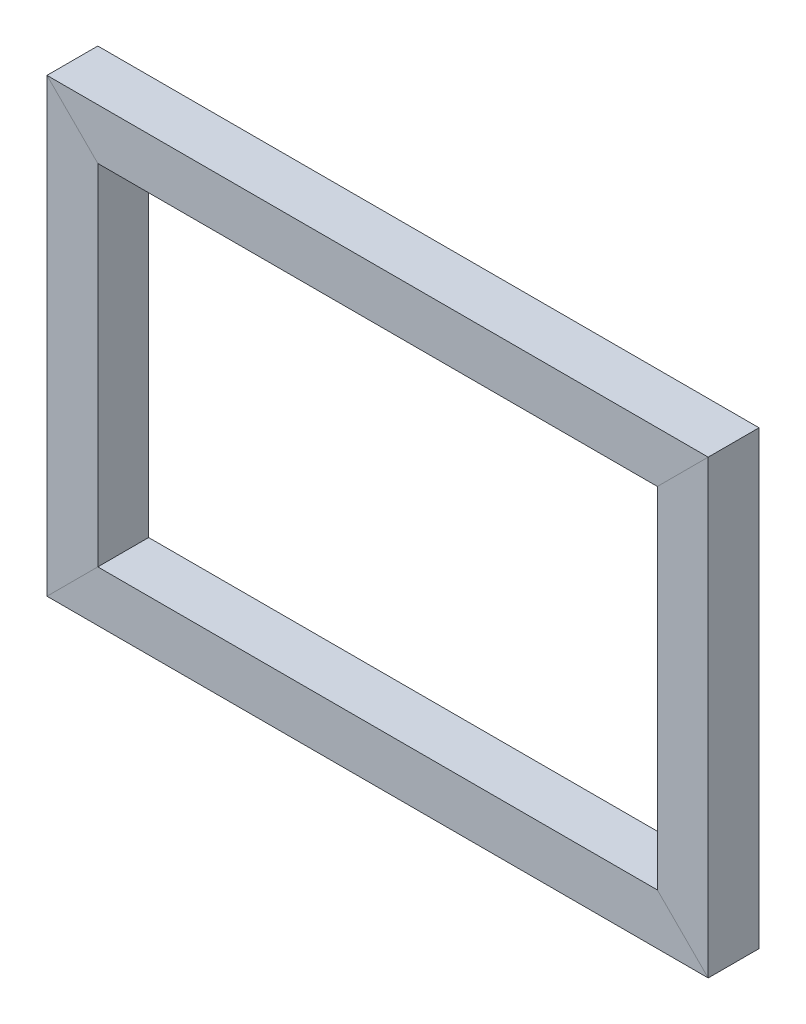
ISO-10303-21;
HEADER;
FILE_DESCRIPTION(('STEP AP214'),'2;1');
FILE_NAME('part.step','',(''),(''),'','','');
FILE_SCHEMA(('AUTOMOTIVE_DESIGN { 1 0 10303 214 1 1 1 1 }'));
ENDSEC;
DATA;
#1=APPLICATION_CONTEXT('core data for automotive mechanical design processes');
#2=APPLICATION_PROTOCOL_DEFINITION('international standard','automotive_design',2000,#1);
#3=PRODUCT_CONTEXT('',#1,'mechanical');
#4=PRODUCT('Part','Part','',(#3));
#5=PRODUCT_RELATED_PRODUCT_CATEGORY('part','',(#4));
#6=PRODUCT_DEFINITION_FORMATION('','',#4);
#7=PRODUCT_DEFINITION_CONTEXT('part definition',#1,'design');
#8=PRODUCT_DEFINITION('design','',#6,#7);
#9=PRODUCT_DEFINITION_SHAPE('','',#8);
#10=(LENGTH_UNIT() NAMED_UNIT(*) SI_UNIT(.MILLI.,.METRE.));
#11=(NAMED_UNIT(*) PLANE_ANGLE_UNIT() SI_UNIT($,.RADIAN.));
#12=(NAMED_UNIT(*) SI_UNIT($,.STERADIAN.) SOLID_ANGLE_UNIT());
#13=UNCERTAINTY_MEASURE_WITH_UNIT(LENGTH_MEASURE(1.E-05),#10,'distance_accuracy_value','');
#14=(GEOMETRIC_REPRESENTATION_CONTEXT(3) GLOBAL_UNCERTAINTY_ASSIGNED_CONTEXT((#13)) GLOBAL_UNIT_ASSIGNED_CONTEXT((#10,
#11,#12)) REPRESENTATION_CONTEXT('',''));
#15=CARTESIAN_POINT('',(0.,0.,0.));
#16=DIRECTION('',(0.,0.,1.));
#17=DIRECTION('',(1.,0.,0.));
#18=AXIS2_PLACEMENT_3D('',#15,#16,#17);
#19=CARTESIAN_POINT('',(-25.4,400.,25.4));
#20=DIRECTION('',(1.,0.,0.));
#21=DIRECTION('',(0.,0.,-1.));
#22=AXIS2_PLACEMENT_3D('',#19,#20,#21);
#23=PLANE('',#22);
#24=DIRECTION('',(0.,0.,-1.));
#25=VECTOR('',#24,1.);
#26=CARTESIAN_POINT('',(-25.4,-25.4,25.4000000000001));
#27=LINE('',#26,#25);
#28=CARTESIAN_POINT('',(-25.4,-25.4,25.4));
#29=VERTEX_POINT('',#28);
#30=CARTESIAN_POINT('',(-25.4,-25.4000000000001,-25.4));
#31=VERTEX_POINT('',#30);
#32=EDGE_CURVE('E153',#29,#31,#27,.T.);
#33=ORIENTED_EDGE('',*,*,#32,.F.);
#34=DIRECTION('',(0.,-1.,0.));
#35=VECTOR('',#34,1.);
#36=CARTESIAN_POINT('',(-25.4,400.,25.4));
#37=LINE('',#36,#35);
#38=CARTESIAN_POINT('',(-25.4,425.4,25.4));
#39=VERTEX_POINT('',#38);
#40=EDGE_CURVE('E182',#39,#29,#37,.T.);
#41=ORIENTED_EDGE('',*,*,#40,.F.);
#42=DIRECTION('',(0.,0.,1.));
#43=VECTOR('',#42,1.);
#44=CARTESIAN_POINT('',(-25.4,425.4,25.4));
#45=LINE('',#44,#43);
#46=CARTESIAN_POINT('',(-25.4,425.4,-25.4));
#47=VERTEX_POINT('',#46);
#48=EDGE_CURVE('E145',#47,#39,#45,.T.);
#49=ORIENTED_EDGE('',*,*,#48,.F.);
#50=DIRECTION('',(0.,-1.,0.));
#51=VECTOR('',#50,1.);
#52=CARTESIAN_POINT('',(-25.4,400.,-25.4));
#53=LINE('',#52,#51);
#54=EDGE_CURVE('E64',#47,#31,#53,.T.);
#55=ORIENTED_EDGE('',*,*,#54,.T.);
#56=EDGE_LOOP('',(#33,#41,#49,#55));
#57=FACE_BOUND('',#56,.T.);
#58=ADVANCED_FACE('F60',(#57),#23,.F.);
#59=CARTESIAN_POINT('',(-25.4,400.,25.4));
#60=DIRECTION('',(0.,0.,-1.));
#61=DIRECTION('',(-1.,0.,0.));
#62=AXIS2_PLACEMENT_3D('',#59,#60,#61);
#63=PLANE('',#62);
#64=DIRECTION('',(-0.707106781186547,-0.707106781186548,0.));
#65=VECTOR('',#64,1.);
#66=CARTESIAN_POINT('',(187.3,187.3,25.4));
#67=LINE('',#66,#65);
#68=CARTESIAN_POINT('',(25.4,25.4,25.4));
#69=VERTEX_POINT('',#68);
#70=EDGE_CURVE('E150',#69,#29,#67,.T.);
#71=ORIENTED_EDGE('',*,*,#70,.F.);
#72=DIRECTION('',(0.,-1.,0.));
#73=VECTOR('',#72,1.);
#74=CARTESIAN_POINT('',(25.4,400.,25.4));
#75=LINE('',#74,#73);
#76=CARTESIAN_POINT('',(25.4,374.6,25.4));
#77=VERTEX_POINT('',#76);
#78=EDGE_CURVE('E181',#77,#69,#75,.T.);
#79=ORIENTED_EDGE('',*,*,#78,.F.);
#80=DIRECTION('',(0.707106781186548,-0.707106781186547,0.));
#81=VECTOR('',#80,1.);
#82=CARTESIAN_POINT('',(-12.7,412.7,25.4));
#83=LINE('',#82,#81);
#84=EDGE_CURVE('E149',#39,#77,#83,.T.);
#85=ORIENTED_EDGE('',*,*,#84,.F.);
#86=ORIENTED_EDGE('',*,*,#40,.T.);
#87=EDGE_LOOP('',(#71,#79,#85,#86));
#88=FACE_BOUND('',#87,.T.);
#89=ADVANCED_FACE('F188',(#88),#63,.F.);
#90=CARTESIAN_POINT('',(25.4,400.,-25.4));
#91=DIRECTION('',(-1.,0.,0.));
#92=DIRECTION('',(0.,0.,1.));
#93=AXIS2_PLACEMENT_3D('',#90,#91,#92);
#94=PLANE('',#93);
#95=DIRECTION('',(0.,0.,1.));
#96=VECTOR('',#95,1.);
#97=CARTESIAN_POINT('',(25.4,25.4,-25.4000000000001));
#98=LINE('',#97,#96);
#99=CARTESIAN_POINT('',(25.4,25.3999999999999,-25.4));
#100=VERTEX_POINT('',#99);
#101=EDGE_CURVE('E13',#100,#69,#98,.T.);
#102=ORIENTED_EDGE('',*,*,#101,.F.);
#103=DIRECTION('',(0.,-1.,0.));
#104=VECTOR('',#103,1.);
#105=CARTESIAN_POINT('',(25.4,400.,-25.4));
#106=LINE('',#105,#104);
#107=CARTESIAN_POINT('',(25.4,374.6,-25.4));
#108=VERTEX_POINT('',#107);
#109=EDGE_CURVE('E127',#108,#100,#106,.T.);
#110=ORIENTED_EDGE('',*,*,#109,.F.);
#111=DIRECTION('',(0.,0.,-1.));
#112=VECTOR('',#111,1.);
#113=CARTESIAN_POINT('',(25.4,374.6,-25.4));
#114=LINE('',#113,#112);
#115=EDGE_CURVE('E132',#77,#108,#114,.T.);
#116=ORIENTED_EDGE('',*,*,#115,.F.);
#117=ORIENTED_EDGE('',*,*,#78,.T.);
#118=EDGE_LOOP('',(#102,#110,#116,#117));
#119=FACE_BOUND('',#118,.T.);
#120=ADVANCED_FACE('F129',(#119),#94,.F.);
#121=CARTESIAN_POINT('',(-24.1554,400.,24.1554));
#122=DIRECTION('',(0.,0.,-1.));
#123=DIRECTION('',(-1.,0.,0.));
#124=AXIS2_PLACEMENT_3D('',#121,#122,#123);
#125=PLANE('',#124);
#126=DIRECTION('',(0.,-1.,0.));
#127=VECTOR('',#126,1.);
#128=CARTESIAN_POINT('',(24.1554,400.,24.1554));
#129=LINE('',#128,#127);
#130=CARTESIAN_POINT('',(24.1554,375.8446,24.1554));
#131=VERTEX_POINT('',#130);
#132=CARTESIAN_POINT('',(24.1554,24.1554,24.1554));
#133=VERTEX_POINT('',#132);
#134=EDGE_CURVE('E166',#131,#133,#129,.T.);
#135=ORIENTED_EDGE('',*,*,#134,.T.);
#136=DIRECTION('',(-0.707106781186547,-0.707106781186548,0.));
#137=VECTOR('',#136,1.);
#138=CARTESIAN_POINT('',(187.9223,187.9223,24.1554));
#139=LINE('',#138,#137);
#140=CARTESIAN_POINT('',(-24.1554,-24.1554,24.1554));
#141=VERTEX_POINT('',#140);
#142=EDGE_CURVE('E94',#133,#141,#139,.T.);
#143=ORIENTED_EDGE('',*,*,#142,.T.);
#144=DIRECTION('',(0.,-1.,0.));
#145=VECTOR('',#144,1.);
#146=CARTESIAN_POINT('',(-24.1554,400.,24.1554));
#147=LINE('',#146,#145);
#148=CARTESIAN_POINT('',(-24.1554,424.1554,24.1554));
#149=VERTEX_POINT('',#148);
#150=EDGE_CURVE('E169',#149,#141,#147,.T.);
#151=ORIENTED_EDGE('',*,*,#150,.F.);
#152=DIRECTION('',(0.707106781186548,-0.707106781186547,0.));
#153=VECTOR('',#152,1.);
#154=CARTESIAN_POINT('',(-12.0777,412.0777,24.1554));
#155=LINE('',#154,#153);
#156=EDGE_CURVE('E165',#149,#131,#155,.T.);
#157=ORIENTED_EDGE('',*,*,#156,.T.);
#158=EDGE_LOOP('',(#135,#143,#151,#157));
#159=FACE_BOUND('',#158,.T.);
#160=ADVANCED_FACE('F205',(#159),#125,.T.);
#161=CARTESIAN_POINT('',(-24.1554,400.,24.1554));
#162=DIRECTION('',(1.,0.,0.));
#163=DIRECTION('',(0.,0.,-1.));
#164=AXIS2_PLACEMENT_3D('',#161,#162,#163);
#165=PLANE('',#164);
#166=ORIENTED_EDGE('',*,*,#150,.T.);
#167=DIRECTION('',(0.,0.,-1.));
#168=VECTOR('',#167,1.);
#169=CARTESIAN_POINT('',(-24.1554,-24.1554,24.1554000000001));
#170=LINE('',#169,#168);
#171=CARTESIAN_POINT('',(-24.1554,-24.1554,-24.1554));
#172=VERTEX_POINT('',#171);
#173=EDGE_CURVE('E79',#141,#172,#170,.T.);
#174=ORIENTED_EDGE('',*,*,#173,.T.);
#175=DIRECTION('',(0.,-1.,0.));
#176=VECTOR('',#175,1.);
#177=CARTESIAN_POINT('',(-24.1554,400.,-24.1554));
#178=LINE('',#177,#176);
#179=CARTESIAN_POINT('',(-24.1554,424.1554,-24.1554));
#180=VERTEX_POINT('',#179);
#181=EDGE_CURVE('E173',#180,#172,#178,.T.);
#182=ORIENTED_EDGE('',*,*,#181,.F.);
#183=DIRECTION('',(0.,0.,1.));
#184=VECTOR('',#183,1.);
#185=CARTESIAN_POINT('',(-24.1554,424.1554,24.1554));
#186=LINE('',#185,#184);
#187=EDGE_CURVE('E168',#180,#149,#186,.T.);
#188=ORIENTED_EDGE('',*,*,#187,.T.);
#189=EDGE_LOOP('',(#166,#174,#182,#188));
#190=FACE_BOUND('',#189,.T.);
#191=ADVANCED_FACE('F203',(#190),#165,.T.);
#192=CARTESIAN_POINT('',(24.1554,400.,-24.1554));
#193=DIRECTION('',(0.,0.,1.));
#194=DIRECTION('',(1.,0.,0.));
#195=AXIS2_PLACEMENT_3D('',#192,#193,#194);
#196=PLANE('',#195);
#197=ORIENTED_EDGE('',*,*,#181,.T.);
#198=DIRECTION('',(0.707106781186547,0.707106781186548,0.));
#199=VECTOR('',#198,1.);
#200=CARTESIAN_POINT('',(212.0777,212.0777,-24.1554));
#201=LINE('',#200,#199);
#202=CARTESIAN_POINT('',(24.1554,24.1554,-24.1554));
#203=VERTEX_POINT('',#202);
#204=EDGE_CURVE('E170',#172,#203,#201,.T.);
#205=ORIENTED_EDGE('',*,*,#204,.T.);
#206=DIRECTION('',(0.,-1.,0.));
#207=VECTOR('',#206,1.);
#208=CARTESIAN_POINT('',(24.1554,400.,-24.1554));
#209=LINE('',#208,#207);
#210=CARTESIAN_POINT('',(24.1554,375.8446,-24.1554));
#211=VERTEX_POINT('',#210);
#212=EDGE_CURVE('E161',#211,#203,#209,.T.);
#213=ORIENTED_EDGE('',*,*,#212,.F.);
#214=DIRECTION('',(-0.707106781186548,0.707106781186547,0.));
#215=VECTOR('',#214,1.);
#216=CARTESIAN_POINT('',(12.0777,387.9223,-24.1554));
#217=LINE('',#216,#215);
#218=EDGE_CURVE('E172',#211,#180,#217,.T.);
#219=ORIENTED_EDGE('',*,*,#218,.T.);
#220=EDGE_LOOP('',(#197,#205,#213,#219));
#221=FACE_BOUND('',#220,.T.);
#222=ADVANCED_FACE('F198',(#221),#196,.T.);
#223=CARTESIAN_POINT('',(24.1554,400.,-24.1554));
#224=DIRECTION('',(-1.,0.,0.));
#225=DIRECTION('',(0.,0.,1.));
#226=AXIS2_PLACEMENT_3D('',#223,#224,#225);
#227=PLANE('',#226);
#228=ORIENTED_EDGE('',*,*,#212,.T.);
#229=DIRECTION('',(0.,0.,1.));
#230=VECTOR('',#229,1.);
#231=CARTESIAN_POINT('',(24.1554,24.1554,-24.1554000000001));
#232=LINE('',#231,#230);
#233=EDGE_CURVE('E89',#203,#133,#232,.T.);
#234=ORIENTED_EDGE('',*,*,#233,.T.);
#235=ORIENTED_EDGE('',*,*,#134,.F.);
#236=DIRECTION('',(0.,0.,-1.));
#237=VECTOR('',#236,1.);
#238=CARTESIAN_POINT('',(24.1554,375.8446,-24.1554));
#239=LINE('',#238,#237);
#240=EDGE_CURVE('E138',#131,#211,#239,.T.);
#241=ORIENTED_EDGE('',*,*,#240,.T.);
#242=EDGE_LOOP('',(#228,#234,#235,#241));
#243=FACE_BOUND('',#242,.T.);
#244=ADVANCED_FACE('F208',(#243),#227,.T.);
#245=CARTESIAN_POINT('',(25.4,400.,-25.4));
#246=DIRECTION('',(0.,0.,1.));
#247=DIRECTION('',(1.,0.,0.));
#248=AXIS2_PLACEMENT_3D('',#245,#246,#247);
#249=PLANE('',#248);
#250=DIRECTION('',(0.707106781186547,0.707106781186548,0.));
#251=VECTOR('',#250,1.);
#252=CARTESIAN_POINT('',(212.7,212.7,-25.4));
#253=LINE('',#252,#251);
#254=EDGE_CURVE('E70',#31,#100,#253,.T.);
#255=ORIENTED_EDGE('',*,*,#254,.F.);
#256=ORIENTED_EDGE('',*,*,#54,.F.);
#257=DIRECTION('',(-0.707106781186548,0.707106781186547,0.));
#258=VECTOR('',#257,1.);
#259=CARTESIAN_POINT('',(12.7,387.3,-25.4));
#260=LINE('',#259,#258);
#261=EDGE_CURVE('E137',#108,#47,#260,.T.);
#262=ORIENTED_EDGE('',*,*,#261,.F.);
#263=ORIENTED_EDGE('',*,*,#109,.T.);
#264=EDGE_LOOP('',(#255,#256,#262,#263));
#265=FACE_BOUND('',#264,.T.);
#266=ADVANCED_FACE('F141',(#265),#249,.F.);
#267=CARTESIAN_POINT('',(0.,400.,0.));
#268=DIRECTION('',(0.707106781186547,0.707106781186548,0.));
#269=DIRECTION('',(-0.707106781186548,0.707106781186547,0.));
#270=AXIS2_PLACEMENT_3D('',#267,#268,#269);
#271=PLANE('',#270);
#272=ORIENTED_EDGE('',*,*,#156,.F.);
#273=ORIENTED_EDGE('',*,*,#187,.F.);
#274=ORIENTED_EDGE('',*,*,#218,.F.);
#275=ORIENTED_EDGE('',*,*,#240,.F.);
#276=EDGE_LOOP('',(#272,#273,#274,#275));
#277=FACE_BOUND('',#276,.T.);
#278=ORIENTED_EDGE('',*,*,#261,.T.);
#279=ORIENTED_EDGE('',*,*,#48,.T.);
#280=ORIENTED_EDGE('',*,*,#84,.T.);
#281=ORIENTED_EDGE('',*,*,#115,.T.);
#282=EDGE_LOOP('',(#278,#279,#280,#281));
#283=FACE_BOUND('',#282,.T.);
#284=ADVANCED_FACE('F148',(#277,#283),#271,.T.);
#285=CARTESIAN_POINT('',(0.,0.,0.));
#286=DIRECTION('',(0.707106781186548,-0.707106781186547,0.));
#287=DIRECTION('',(0.707106781186547,0.707106781186548,0.));
#288=AXIS2_PLACEMENT_3D('',#285,#286,#287);
#289=PLANE('',#288);
#290=ORIENTED_EDGE('',*,*,#142,.F.);
#291=ORIENTED_EDGE('',*,*,#233,.F.);
#292=ORIENTED_EDGE('',*,*,#204,.F.);
#293=ORIENTED_EDGE('',*,*,#173,.F.);
#294=EDGE_LOOP('',(#290,#291,#292,#293));
#295=FACE_BOUND('',#294,.T.);
#296=ORIENTED_EDGE('',*,*,#70,.T.);
#297=ORIENTED_EDGE('',*,*,#32,.T.);
#298=ORIENTED_EDGE('',*,*,#254,.T.);
#299=ORIENTED_EDGE('',*,*,#101,.T.);
#300=EDGE_LOOP('',(#296,#297,#298,#299));
#301=FACE_BOUND('',#300,.T.);
#302=ADVANCED_FACE('F62',(#295,#301),#289,.T.);
#303=CLOSED_SHELL('',(#58,#89,#120,#160,#191,#222,#244,#266,#284,#302));
#304=MANIFOLD_SOLID_BREP('B2',#303);
#305=CARTESIAN_POINT('',(1.11022302462516E-13,-25.4,25.4));
#306=DIRECTION('',(0.,1.,0.));
#307=DIRECTION('',(0.,0.,1.));
#308=AXIS2_PLACEMENT_3D('',#305,#306,#307);
#309=PLANE('',#308);
#310=DIRECTION('',(0.,0.,1.));
#311=VECTOR('',#310,1.);
#312=CARTESIAN_POINT('',(-25.4,-25.4,25.4));
#313=LINE('',#312,#311);
#314=CARTESIAN_POINT('',(-25.4,-25.4,-25.4));
#315=VERTEX_POINT('',#314);
#316=CARTESIAN_POINT('',(-25.4,-25.4,25.4));
#317=VERTEX_POINT('',#316);
#318=EDGE_CURVE('E396',#315,#317,#313,.T.);
#319=ORIENTED_EDGE('',*,*,#318,.F.);
#320=DIRECTION('',(1.,0.,0.));
#321=VECTOR('',#320,1.);
#322=CARTESIAN_POINT('',(1.11022302462516E-13,-25.4,-25.4));
#323=LINE('',#322,#321);
#324=CARTESIAN_POINT('',(635.4,-25.4,-25.4));
#325=VERTEX_POINT('',#324);
#326=EDGE_CURVE('E320',#315,#325,#323,.T.);
#327=ORIENTED_EDGE('',*,*,#326,.T.);
#328=DIRECTION('',(0.,0.,-1.));
#329=VECTOR('',#328,1.);
#330=CARTESIAN_POINT('',(635.4,-25.4,25.4000000000001));
#331=LINE('',#330,#329);
#332=CARTESIAN_POINT('',(635.4,-25.4,25.4));
#333=VERTEX_POINT('',#332);
#334=EDGE_CURVE('E430',#333,#325,#331,.T.);
#335=ORIENTED_EDGE('',*,*,#334,.F.);
#336=DIRECTION('',(1.,0.,0.));
#337=VECTOR('',#336,1.);
#338=CARTESIAN_POINT('',(1.11022302462516E-13,-25.4,25.4));
#339=LINE('',#338,#337);
#340=EDGE_CURVE('E425',#317,#333,#339,.T.);
#341=ORIENTED_EDGE('',*,*,#340,.F.);
#342=EDGE_LOOP('',(#319,#327,#335,#341));
#343=FACE_BOUND('',#342,.T.);
#344=ADVANCED_FACE('F316',(#343),#309,.F.);
#345=CARTESIAN_POINT('',(1.11022302462516E-13,-25.4,25.4));
#346=DIRECTION('',(0.,0.,-1.));
#347=DIRECTION('',(-1.,0.,0.));
#348=AXIS2_PLACEMENT_3D('',#345,#346,#347);
#349=PLANE('',#348);
#350=DIRECTION('',(0.707106781186548,0.707106781186548,0.));
#351=VECTOR('',#350,1.);
#352=CARTESIAN_POINT('',(-12.6999999999999,-12.6999999999999,25.4));
#353=LINE('',#352,#351);
#354=CARTESIAN_POINT('',(25.4,25.4,25.4));
#355=VERTEX_POINT('',#354);
#356=EDGE_CURVE('E326',#317,#355,#353,.T.);
#357=ORIENTED_EDGE('',*,*,#356,.F.);
#358=ORIENTED_EDGE('',*,*,#340,.T.);
#359=DIRECTION('',(0.707106781186548,-0.707106781186547,0.));
#360=VECTOR('',#359,1.);
#361=CARTESIAN_POINT('',(317.7,292.3,25.4));
#362=LINE('',#361,#360);
#363=CARTESIAN_POINT('',(584.6,25.4,25.4));
#364=VERTEX_POINT('',#363);
#365=EDGE_CURVE('E386',#364,#333,#362,.T.);
#366=ORIENTED_EDGE('',*,*,#365,.F.);
#367=DIRECTION('',(1.,0.,0.));
#368=VECTOR('',#367,1.);
#369=CARTESIAN_POINT('',(1.11022302462516E-13,25.4,25.4));
#370=LINE('',#369,#368);
#371=EDGE_CURVE('E408',#355,#364,#370,.T.);
#372=ORIENTED_EDGE('',*,*,#371,.F.);
#373=EDGE_LOOP('',(#357,#358,#366,#372));
#374=FACE_BOUND('',#373,.T.);
#375=ADVANCED_FACE('F473',(#374),#349,.F.);
#376=CARTESIAN_POINT('',(1.11022302462516E-13,25.4,-25.4));
#377=DIRECTION('',(0.,-1.,0.));
#378=DIRECTION('',(0.,0.,-1.));
#379=AXIS2_PLACEMENT_3D('',#376,#377,#378);
#380=PLANE('',#379);
#381=DIRECTION('',(0.,0.,-1.));
#382=VECTOR('',#381,1.);
#383=CARTESIAN_POINT('',(25.4,25.4,-25.4));
#384=LINE('',#383,#382);
#385=CARTESIAN_POINT('',(25.4,25.4,-25.4));
#386=VERTEX_POINT('',#385);
#387=EDGE_CURVE('E58',#355,#386,#384,.T.);
#388=ORIENTED_EDGE('',*,*,#387,.F.);
#389=ORIENTED_EDGE('',*,*,#371,.T.);
#390=DIRECTION('',(0.,0.,1.));
#391=VECTOR('',#390,1.);
#392=CARTESIAN_POINT('',(584.6,25.4,-25.4000000000001));
#393=LINE('',#392,#391);
#394=CARTESIAN_POINT('',(584.6,25.4,-25.4));
#395=VERTEX_POINT('',#394);
#396=EDGE_CURVE('E382',#395,#364,#393,.T.);
#397=ORIENTED_EDGE('',*,*,#396,.F.);
#398=DIRECTION('',(1.,0.,0.));
#399=VECTOR('',#398,1.);
#400=CARTESIAN_POINT('',(1.11022302462516E-13,25.4,-25.4));
#401=LINE('',#400,#399);
#402=EDGE_CURVE('E377',#386,#395,#401,.T.);
#403=ORIENTED_EDGE('',*,*,#402,.F.);
#404=EDGE_LOOP('',(#388,#389,#397,#403));
#405=FACE_BOUND('',#404,.T.);
#406=ADVANCED_FACE('F379',(#405),#380,.F.);
#407=CARTESIAN_POINT('',(1.11022302462516E-13,-24.1554,24.1554));
#408=DIRECTION('',(0.,0.,-1.));
#409=DIRECTION('',(-1.,0.,0.));
#410=AXIS2_PLACEMENT_3D('',#407,#408,#409);
#411=PLANE('',#410);
#412=DIRECTION('',(1.,0.,0.));
#413=VECTOR('',#412,1.);
#414=CARTESIAN_POINT('',(1.11022302462516E-13,-24.1554,24.1554));
#415=LINE('',#414,#413);
#416=CARTESIAN_POINT('',(-24.1554,-24.1554,24.1554));
#417=VERTEX_POINT('',#416);
#418=CARTESIAN_POINT('',(634.1554,-24.1554,24.1554));
#419=VERTEX_POINT('',#418);
#420=EDGE_CURVE('E412',#417,#419,#415,.T.);
#421=ORIENTED_EDGE('',*,*,#420,.F.);
#422=DIRECTION('',(0.707106781186548,0.707106781186548,0.));
#423=VECTOR('',#422,1.);
#424=CARTESIAN_POINT('',(-12.0777,-12.0776999999999,24.1554));
#425=LINE('',#424,#423);
#426=CARTESIAN_POINT('',(24.1554,24.1554,24.1554));
#427=VERTEX_POINT('',#426);
#428=EDGE_CURVE('E405',#417,#427,#425,.T.);
#429=ORIENTED_EDGE('',*,*,#428,.T.);
#430=DIRECTION('',(1.,0.,0.));
#431=VECTOR('',#430,1.);
#432=CARTESIAN_POINT('',(1.11022302462516E-13,24.1554,24.1554));
#433=LINE('',#432,#431);
#434=CARTESIAN_POINT('',(585.8446,24.1554,24.1554));
#435=VERTEX_POINT('',#434);
#436=EDGE_CURVE('E407',#427,#435,#433,.T.);
#437=ORIENTED_EDGE('',*,*,#436,.T.);
#438=DIRECTION('',(0.707106781186548,-0.707106781186547,0.));
#439=VECTOR('',#438,1.);
#440=CARTESIAN_POINT('',(317.0777,292.9223,24.1554));
#441=LINE('',#440,#439);
#442=EDGE_CURVE('E413',#435,#419,#441,.T.);
#443=ORIENTED_EDGE('',*,*,#442,.T.);
#444=EDGE_LOOP('',(#421,#429,#437,#443));
#445=FACE_BOUND('',#444,.T.);
#446=ADVANCED_FACE('F455',(#445),#411,.T.);
#447=CARTESIAN_POINT('',(1.11022302462516E-13,-24.1554,24.1554));
#448=DIRECTION('',(0.,1.,0.));
#449=DIRECTION('',(0.,0.,1.));
#450=AXIS2_PLACEMENT_3D('',#447,#448,#449);
#451=PLANE('',#450);
#452=DIRECTION('',(1.,0.,0.));
#453=VECTOR('',#452,1.);
#454=CARTESIAN_POINT('',(1.11022302462516E-13,-24.1554,-24.1554));
#455=LINE('',#454,#453);
#456=CARTESIAN_POINT('',(-24.1554,-24.1554,-24.1554));
#457=VERTEX_POINT('',#456);
#458=CARTESIAN_POINT('',(634.1554,-24.1554,-24.1554));
#459=VERTEX_POINT('',#458);
#460=EDGE_CURVE('E416',#457,#459,#455,.T.);
#461=ORIENTED_EDGE('',*,*,#460,.F.);
#462=DIRECTION('',(0.,0.,1.));
#463=VECTOR('',#462,1.);
#464=CARTESIAN_POINT('',(-24.1554,-24.1554,24.1554));
#465=LINE('',#464,#463);
#466=EDGE_CURVE('E409',#457,#417,#465,.T.);
#467=ORIENTED_EDGE('',*,*,#466,.T.);
#468=ORIENTED_EDGE('',*,*,#420,.T.);
#469=DIRECTION('',(0.,0.,-1.));
#470=VECTOR('',#469,1.);
#471=CARTESIAN_POINT('',(634.1554,-24.1554,24.1554000000001));
#472=LINE('',#471,#470);
#473=EDGE_CURVE('E417',#419,#459,#472,.T.);
#474=ORIENTED_EDGE('',*,*,#473,.T.);
#475=EDGE_LOOP('',(#461,#467,#468,#474));
#476=FACE_BOUND('',#475,.T.);
#477=ADVANCED_FACE('F463',(#476),#451,.T.);
#478=CARTESIAN_POINT('',(1.11022302462516E-13,24.1554,-24.1554));
#479=DIRECTION('',(0.,0.,1.));
#480=DIRECTION('',(1.,0.,0.));
#481=AXIS2_PLACEMENT_3D('',#478,#479,#480);
#482=PLANE('',#481);
#483=DIRECTION('',(1.,0.,0.));
#484=VECTOR('',#483,1.);
#485=CARTESIAN_POINT('',(1.11022302462516E-13,24.1554,-24.1554));
#486=LINE('',#485,#484);
#487=CARTESIAN_POINT('',(24.1554,24.1554,-24.1554));
#488=VERTEX_POINT('',#487);
#489=CARTESIAN_POINT('',(585.8446,24.1554,-24.1554));
#490=VERTEX_POINT('',#489);
#491=EDGE_CURVE('E419',#488,#490,#486,.T.);
#492=ORIENTED_EDGE('',*,*,#491,.F.);
#493=DIRECTION('',(-0.707106781186548,-0.707106781186548,0.));
#494=VECTOR('',#493,1.);
#495=CARTESIAN_POINT('',(12.0777000000001,12.0777000000001,-24.1554));
#496=LINE('',#495,#494);
#497=EDGE_CURVE('E414',#488,#457,#496,.T.);
#498=ORIENTED_EDGE('',*,*,#497,.T.);
#499=ORIENTED_EDGE('',*,*,#460,.T.);
#500=DIRECTION('',(-0.707106781186548,0.707106781186547,0.));
#501=VECTOR('',#500,1.);
#502=CARTESIAN_POINT('',(292.9223,317.0777,-24.1554));
#503=LINE('',#502,#501);
#504=EDGE_CURVE('E422',#459,#490,#503,.T.);
#505=ORIENTED_EDGE('',*,*,#504,.T.);
#506=EDGE_LOOP('',(#492,#498,#499,#505));
#507=FACE_BOUND('',#506,.T.);
#508=ADVANCED_FACE('F460',(#507),#482,.T.);
#509=CARTESIAN_POINT('',(1.11022302462516E-13,24.1554,-24.1554));
#510=DIRECTION('',(0.,-1.,0.));
#511=DIRECTION('',(0.,0.,-1.));
#512=AXIS2_PLACEMENT_3D('',#509,#510,#511);
#513=PLANE('',#512);
#514=ORIENTED_EDGE('',*,*,#436,.F.);
#515=DIRECTION('',(0.,0.,-1.));
#516=VECTOR('',#515,1.);
#517=CARTESIAN_POINT('',(24.1554,24.1554,-24.1554));
#518=LINE('',#517,#516);
#519=EDGE_CURVE('E334',#427,#488,#518,.T.);
#520=ORIENTED_EDGE('',*,*,#519,.T.);
#521=ORIENTED_EDGE('',*,*,#491,.T.);
#522=DIRECTION('',(0.,0.,1.));
#523=VECTOR('',#522,1.);
#524=CARTESIAN_POINT('',(585.8446,24.1554,-24.1554000000001));
#525=LINE('',#524,#523);
#526=EDGE_CURVE('E387',#490,#435,#525,.T.);
#527=ORIENTED_EDGE('',*,*,#526,.T.);
#528=EDGE_LOOP('',(#514,#520,#521,#527));
#529=FACE_BOUND('',#528,.T.);
#530=ADVANCED_FACE('F459',(#529),#513,.T.);
#531=CARTESIAN_POINT('',(1.11022302462516E-13,25.4,-25.4));
#532=DIRECTION('',(0.,0.,1.));
#533=DIRECTION('',(0.,-1.,0.));
#534=AXIS2_PLACEMENT_3D('',#531,#532,#533);
#535=PLANE('',#534);
#536=DIRECTION('',(-0.707106781186548,-0.707106781186548,0.));
#537=VECTOR('',#536,1.);
#538=CARTESIAN_POINT('',(12.7,12.7000000000001,-25.4));
#539=LINE('',#538,#537);
#540=EDGE_CURVE('E391',#386,#315,#539,.T.);
#541=ORIENTED_EDGE('',*,*,#540,.F.);
#542=ORIENTED_EDGE('',*,*,#402,.T.);
#543=DIRECTION('',(-0.707106781186548,0.707106781186547,0.));
#544=VECTOR('',#543,1.);
#545=CARTESIAN_POINT('',(292.3,317.7,-25.4000000000001));
#546=LINE('',#545,#544);
#547=EDGE_CURVE('E432',#325,#395,#546,.T.);
#548=ORIENTED_EDGE('',*,*,#547,.F.);
#549=ORIENTED_EDGE('',*,*,#326,.F.);
#550=EDGE_LOOP('',(#541,#542,#548,#549));
#551=FACE_BOUND('',#550,.T.);
#552=ADVANCED_FACE('F392',(#551),#535,.F.);
#553=CARTESIAN_POINT('',(610.,0.,0.));
#554=DIRECTION('',(0.707106781186547,0.707106781186548,0.));
#555=DIRECTION('',(-0.707106781186548,0.707106781186547,0.));
#556=AXIS2_PLACEMENT_3D('',#553,#554,#555);
#557=PLANE('',#556);
#558=ORIENTED_EDGE('',*,*,#442,.F.);
#559=ORIENTED_EDGE('',*,*,#526,.F.);
#560=ORIENTED_EDGE('',*,*,#504,.F.);
#561=ORIENTED_EDGE('',*,*,#473,.F.);
#562=EDGE_LOOP('',(#558,#559,#560,#561));
#563=FACE_BOUND('',#562,.T.);
#564=ORIENTED_EDGE('',*,*,#365,.T.);
#565=ORIENTED_EDGE('',*,*,#334,.T.);
#566=ORIENTED_EDGE('',*,*,#547,.T.);
#567=ORIENTED_EDGE('',*,*,#396,.T.);
#568=EDGE_LOOP('',(#564,#565,#566,#567));
#569=FACE_BOUND('',#568,.T.);
#570=ADVANCED_FACE('F435',(#563,#569),#557,.T.);
#571=CARTESIAN_POINT('',(0.,0.,0.));
#572=DIRECTION('',(-0.707106781186548,0.707106781186548,0.));
#573=DIRECTION('',(-0.707106781186548,-0.707106781186548,0.));
#574=AXIS2_PLACEMENT_3D('',#571,#572,#573);
#575=PLANE('',#574);
#576=ORIENTED_EDGE('',*,*,#428,.F.);
#577=ORIENTED_EDGE('',*,*,#466,.F.);
#578=ORIENTED_EDGE('',*,*,#497,.F.);
#579=ORIENTED_EDGE('',*,*,#519,.F.);
#580=EDGE_LOOP('',(#576,#577,#578,#579));
#581=FACE_BOUND('',#580,.T.);
#582=ORIENTED_EDGE('',*,*,#540,.T.);
#583=ORIENTED_EDGE('',*,*,#318,.T.);
#584=ORIENTED_EDGE('',*,*,#356,.T.);
#585=ORIENTED_EDGE('',*,*,#387,.T.);
#586=EDGE_LOOP('',(#582,#583,#584,#585));
#587=FACE_BOUND('',#586,.T.);
#588=ADVANCED_FACE('F318',(#581,#587),#575,.T.);
#589=CLOSED_SHELL('',(#344,#375,#406,#446,#477,#508,#530,#552,#570,#588));
#590=MANIFOLD_SOLID_BREP('B7',#589);
#591=CARTESIAN_POINT('',(610.,425.4,25.4));
#592=DIRECTION('',(0.,-1.,0.));
#593=DIRECTION('',(0.,0.,-1.));
#594=AXIS2_PLACEMENT_3D('',#591,#592,#593);
#595=PLANE('',#594);
#596=DIRECTION('',(0.,0.,-1.));
#597=VECTOR('',#596,1.);
#598=CARTESIAN_POINT('',(-25.4,425.4,25.4000000000001));
#599=LINE('',#598,#597);
#600=CARTESIAN_POINT('',(-25.4,425.4,25.4));
#601=VERTEX_POINT('',#600);
#602=CARTESIAN_POINT('',(-25.4,425.4,-25.4));
#603=VERTEX_POINT('',#602);
#604=EDGE_CURVE('E664',#601,#603,#599,.T.);
#605=ORIENTED_EDGE('',*,*,#604,.F.);
#606=DIRECTION('',(-1.,0.,0.));
#607=VECTOR('',#606,1.);
#608=CARTESIAN_POINT('',(610.,425.4,25.4));
#609=LINE('',#608,#607);
#610=CARTESIAN_POINT('',(635.4,425.4,25.4));
#611=VERTEX_POINT('',#610);
#612=EDGE_CURVE('E693',#611,#601,#609,.T.);
#613=ORIENTED_EDGE('',*,*,#612,.F.);
#614=DIRECTION('',(0.,0.,1.));
#615=VECTOR('',#614,1.);
#616=CARTESIAN_POINT('',(635.4,425.4,25.4));
#617=LINE('',#616,#615);
#618=CARTESIAN_POINT('',(635.4,425.4,-25.4));
#619=VERTEX_POINT('',#618);
#620=EDGE_CURVE('E656',#619,#611,#617,.T.);
#621=ORIENTED_EDGE('',*,*,#620,.F.);
#622=DIRECTION('',(-1.,0.,0.));
#623=VECTOR('',#622,1.);
#624=CARTESIAN_POINT('',(610.,425.4,-25.4));
#625=LINE('',#624,#623);
#626=EDGE_CURVE('E575',#619,#603,#625,.T.);
#627=ORIENTED_EDGE('',*,*,#626,.T.);
#628=EDGE_LOOP('',(#605,#613,#621,#627));
#629=FACE_BOUND('',#628,.T.);
#630=ADVANCED_FACE('F571',(#629),#595,.F.);
#631=CARTESIAN_POINT('',(610.,425.4,25.4));
#632=DIRECTION('',(0.,0.,-1.));
#633=DIRECTION('',(-1.,0.,0.));
#634=AXIS2_PLACEMENT_3D('',#631,#632,#633);
#635=PLANE('',#634);
#636=DIRECTION('',(-0.707106781186547,0.707106781186548,0.));
#637=VECTOR('',#636,1.);
#638=CARTESIAN_POINT('',(292.3,107.7,25.4));
#639=LINE('',#638,#637);
#640=CARTESIAN_POINT('',(25.4,374.6,25.4));
#641=VERTEX_POINT('',#640);
#642=EDGE_CURVE('E661',#641,#601,#639,.T.);
#643=ORIENTED_EDGE('',*,*,#642,.F.);
#644=DIRECTION('',(-1.,0.,0.));
#645=VECTOR('',#644,1.);
#646=CARTESIAN_POINT('',(610.,374.6,25.4));
#647=LINE('',#646,#645);
#648=CARTESIAN_POINT('',(584.6,374.6,25.4));
#649=VERTEX_POINT('',#648);
#650=EDGE_CURVE('E692',#649,#641,#647,.T.);
#651=ORIENTED_EDGE('',*,*,#650,.F.);
#652=DIRECTION('',(-0.707106781186547,-0.707106781186548,0.));
#653=VECTOR('',#652,1.);
#654=CARTESIAN_POINT('',(622.7,412.7,25.4));
#655=LINE('',#654,#653);
#656=EDGE_CURVE('E660',#611,#649,#655,.T.);
#657=ORIENTED_EDGE('',*,*,#656,.F.);
#658=ORIENTED_EDGE('',*,*,#612,.T.);
#659=EDGE_LOOP('',(#643,#651,#657,#658));
#660=FACE_BOUND('',#659,.T.);
#661=ADVANCED_FACE('F699',(#660),#635,.F.);
#662=CARTESIAN_POINT('',(610.,374.6,-25.4));
#663=DIRECTION('',(0.,1.,0.));
#664=DIRECTION('',(0.,0.,1.));
#665=AXIS2_PLACEMENT_3D('',#662,#663,#664);
#666=PLANE('',#665);
#667=DIRECTION('',(0.,0.,1.));
#668=VECTOR('',#667,1.);
#669=CARTESIAN_POINT('',(25.4,374.6,-25.4000000000001));
#670=LINE('',#669,#668);
#671=CARTESIAN_POINT('',(25.3999999999999,374.6,-25.4));
#672=VERTEX_POINT('',#671);
#673=EDGE_CURVE('E314',#672,#641,#670,.T.);
#674=ORIENTED_EDGE('',*,*,#673,.F.);
#675=DIRECTION('',(-1.,0.,0.));
#676=VECTOR('',#675,1.);
#677=CARTESIAN_POINT('',(610.,374.6,-25.4));
#678=LINE('',#677,#676);
#679=CARTESIAN_POINT('',(584.6,374.6,-25.4));
#680=VERTEX_POINT('',#679);
#681=EDGE_CURVE('E638',#680,#672,#678,.T.);
#682=ORIENTED_EDGE('',*,*,#681,.F.);
#683=DIRECTION('',(0.,0.,-1.));
#684=VECTOR('',#683,1.);
#685=CARTESIAN_POINT('',(584.6,374.6,-25.4));
#686=LINE('',#685,#684);
#687=EDGE_CURVE('E643',#649,#680,#686,.T.);
#688=ORIENTED_EDGE('',*,*,#687,.F.);
#689=ORIENTED_EDGE('',*,*,#650,.T.);
#690=EDGE_LOOP('',(#674,#682,#688,#689));
#691=FACE_BOUND('',#690,.T.);
#692=ADVANCED_FACE('F640',(#691),#666,.F.);
#693=CARTESIAN_POINT('',(610.,424.1554,24.1554));
#694=DIRECTION('',(0.,0.,-1.));
#695=DIRECTION('',(-1.,0.,0.));
#696=AXIS2_PLACEMENT_3D('',#693,#694,#695);
#697=PLANE('',#696);
#698=DIRECTION('',(-1.,0.,0.));
#699=VECTOR('',#698,1.);
#700=CARTESIAN_POINT('',(610.,375.8446,24.1554));
#701=LINE('',#700,#699);
#702=CARTESIAN_POINT('',(585.8446,375.8446,24.1554));
#703=VERTEX_POINT('',#702);
#704=CARTESIAN_POINT('',(24.1553999999999,375.8446,24.1554));
#705=VERTEX_POINT('',#704);
#706=EDGE_CURVE('E677',#703,#705,#701,.T.);
#707=ORIENTED_EDGE('',*,*,#706,.T.);
#708=DIRECTION('',(-0.707106781186547,0.707106781186548,0.));
#709=VECTOR('',#708,1.);
#710=CARTESIAN_POINT('',(292.9223,107.0777,24.1554));
#711=LINE('',#710,#709);
#712=CARTESIAN_POINT('',(-24.1554,424.1554,24.1554));
#713=VERTEX_POINT('',#712);
#714=EDGE_CURVE('E605',#705,#713,#711,.T.);
#715=ORIENTED_EDGE('',*,*,#714,.T.);
#716=DIRECTION('',(-1.,0.,0.));
#717=VECTOR('',#716,1.);
#718=CARTESIAN_POINT('',(610.,424.1554,24.1554));
#719=LINE('',#718,#717);
#720=CARTESIAN_POINT('',(634.1554,424.1554,24.1554));
#721=VERTEX_POINT('',#720);
#722=EDGE_CURVE('E680',#721,#713,#719,.T.);
#723=ORIENTED_EDGE('',*,*,#722,.F.);
#724=DIRECTION('',(-0.707106781186547,-0.707106781186548,0.));
#725=VECTOR('',#724,1.);
#726=CARTESIAN_POINT('',(622.0777,412.0777,24.1554));
#727=LINE('',#726,#725);
#728=EDGE_CURVE('E676',#721,#703,#727,.T.);
#729=ORIENTED_EDGE('',*,*,#728,.T.);
#730=EDGE_LOOP('',(#707,#715,#723,#729));
#731=FACE_BOUND('',#730,.T.);
#732=ADVANCED_FACE('F716',(#731),#697,.T.);
#733=CARTESIAN_POINT('',(610.,424.1554,24.1554));
#734=DIRECTION('',(0.,-1.,0.));
#735=DIRECTION('',(0.,0.,-1.));
#736=AXIS2_PLACEMENT_3D('',#733,#734,#735);
#737=PLANE('',#736);
#738=ORIENTED_EDGE('',*,*,#722,.T.);
#739=DIRECTION('',(0.,0.,-1.));
#740=VECTOR('',#739,1.);
#741=CARTESIAN_POINT('',(-24.1554,424.1554,24.1554000000001));
#742=LINE('',#741,#740);
#743=CARTESIAN_POINT('',(-24.1553999999999,424.1554,-24.1554));
#744=VERTEX_POINT('',#743);
#745=EDGE_CURVE('E590',#713,#744,#742,.T.);
#746=ORIENTED_EDGE('',*,*,#745,.T.);
#747=DIRECTION('',(-1.,0.,0.));
#748=VECTOR('',#747,1.);
#749=CARTESIAN_POINT('',(610.,424.1554,-24.1554));
#750=LINE('',#749,#748);
#751=CARTESIAN_POINT('',(634.1554,424.1554,-24.1554));
#752=VERTEX_POINT('',#751);
#753=EDGE_CURVE('E684',#752,#744,#750,.T.);
#754=ORIENTED_EDGE('',*,*,#753,.F.);
#755=DIRECTION('',(0.,0.,1.));
#756=VECTOR('',#755,1.);
#757=CARTESIAN_POINT('',(634.1554,424.1554,24.1554));
#758=LINE('',#757,#756);
#759=EDGE_CURVE('E679',#752,#721,#758,.T.);
#760=ORIENTED_EDGE('',*,*,#759,.T.);
#761=EDGE_LOOP('',(#738,#746,#754,#760));
#762=FACE_BOUND('',#761,.T.);
#763=ADVANCED_FACE('F714',(#762),#737,.T.);
#764=CARTESIAN_POINT('',(610.,375.8446,-24.1554));
#765=DIRECTION('',(0.,0.,1.));
#766=DIRECTION('',(1.,0.,0.));
#767=AXIS2_PLACEMENT_3D('',#764,#765,#766);
#768=PLANE('',#767);
#769=ORIENTED_EDGE('',*,*,#753,.T.);
#770=DIRECTION('',(0.707106781186547,-0.707106781186548,0.));
#771=VECTOR('',#770,1.);
#772=CARTESIAN_POINT('',(317.0777,82.9223,-24.1554));
#773=LINE('',#772,#771);
#774=CARTESIAN_POINT('',(24.1553999999999,375.8446,-24.1554));
#775=VERTEX_POINT('',#774);
#776=EDGE_CURVE('E681',#744,#775,#773,.T.);
#777=ORIENTED_EDGE('',*,*,#776,.T.);
#778=DIRECTION('',(-1.,0.,0.));
#779=VECTOR('',#778,1.);
#780=CARTESIAN_POINT('',(610.,375.8446,-24.1554));
#781=LINE('',#780,#779);
#782=CARTESIAN_POINT('',(585.8446,375.8446,-24.1554));
#783=VERTEX_POINT('',#782);
#784=EDGE_CURVE('E672',#783,#775,#781,.T.);
#785=ORIENTED_EDGE('',*,*,#784,.F.);
#786=DIRECTION('',(0.707106781186547,0.707106781186548,0.));
#787=VECTOR('',#786,1.);
#788=CARTESIAN_POINT('',(597.9223,387.9223,-24.1554));
#789=LINE('',#788,#787);
#790=EDGE_CURVE('E683',#783,#752,#789,.T.);
#791=ORIENTED_EDGE('',*,*,#790,.T.);
#792=EDGE_LOOP('',(#769,#777,#785,#791));
#793=FACE_BOUND('',#792,.T.);
#794=ADVANCED_FACE('F709',(#793),#768,.T.);
#795=CARTESIAN_POINT('',(610.,375.8446,-24.1554));
#796=DIRECTION('',(0.,1.,0.));
#797=DIRECTION('',(0.,0.,1.));
#798=AXIS2_PLACEMENT_3D('',#795,#796,#797);
#799=PLANE('',#798);
#800=ORIENTED_EDGE('',*,*,#784,.T.);
#801=DIRECTION('',(0.,0.,1.));
#802=VECTOR('',#801,1.);
#803=CARTESIAN_POINT('',(24.1553999999999,375.8446,-24.1554000000001));
#804=LINE('',#803,#802);
#805=EDGE_CURVE('E600',#775,#705,#804,.T.);
#806=ORIENTED_EDGE('',*,*,#805,.T.);
#807=ORIENTED_EDGE('',*,*,#706,.F.);
#808=DIRECTION('',(0.,0.,-1.));
#809=VECTOR('',#808,1.);
#810=CARTESIAN_POINT('',(585.8446,375.8446,-24.1554));
#811=LINE('',#810,#809);
#812=EDGE_CURVE('E649',#703,#783,#811,.T.);
#813=ORIENTED_EDGE('',*,*,#812,.T.);
#814=EDGE_LOOP('',(#800,#806,#807,#813));
#815=FACE_BOUND('',#814,.T.);
#816=ADVANCED_FACE('F719',(#815),#799,.T.);
#817=CARTESIAN_POINT('',(610.,374.6,-25.4));
#818=DIRECTION('',(0.,0.,1.));
#819=DIRECTION('',(0.,-1.,0.));
#820=AXIS2_PLACEMENT_3D('',#817,#818,#819);
#821=PLANE('',#820);
#822=DIRECTION('',(0.707106781186547,-0.707106781186548,0.));
#823=VECTOR('',#822,1.);
#824=CARTESIAN_POINT('',(317.7,82.3,-25.4));
#825=LINE('',#824,#823);
#826=EDGE_CURVE('E581',#603,#672,#825,.T.);
#827=ORIENTED_EDGE('',*,*,#826,.F.);
#828=ORIENTED_EDGE('',*,*,#626,.F.);
#829=DIRECTION('',(0.707106781186547,0.707106781186548,0.));
#830=VECTOR('',#829,1.);
#831=CARTESIAN_POINT('',(597.3,387.3,-25.4));
#832=LINE('',#831,#830);
#833=EDGE_CURVE('E648',#680,#619,#832,.T.);
#834=ORIENTED_EDGE('',*,*,#833,.F.);
#835=ORIENTED_EDGE('',*,*,#681,.T.);
#836=EDGE_LOOP('',(#827,#828,#834,#835));
#837=FACE_BOUND('',#836,.T.);
#838=ADVANCED_FACE('F652',(#837),#821,.F.);
#839=CARTESIAN_POINT('',(610.,400.,0.));
#840=DIRECTION('',(0.707106781186548,-0.707106781186547,0.));
#841=DIRECTION('',(0.707106781186547,0.707106781186548,0.));
#842=AXIS2_PLACEMENT_3D('',#839,#840,#841);
#843=PLANE('',#842);
#844=ORIENTED_EDGE('',*,*,#728,.F.);
#845=ORIENTED_EDGE('',*,*,#759,.F.);
#846=ORIENTED_EDGE('',*,*,#790,.F.);
#847=ORIENTED_EDGE('',*,*,#812,.F.);
#848=EDGE_LOOP('',(#844,#845,#846,#847));
#849=FACE_BOUND('',#848,.T.);
#850=ORIENTED_EDGE('',*,*,#833,.T.);
#851=ORIENTED_EDGE('',*,*,#620,.T.);
#852=ORIENTED_EDGE('',*,*,#656,.T.);
#853=ORIENTED_EDGE('',*,*,#687,.T.);
#854=EDGE_LOOP('',(#850,#851,#852,#853));
#855=FACE_BOUND('',#854,.T.);
#856=ADVANCED_FACE('F659',(#849,#855),#843,.T.);
#857=CARTESIAN_POINT('',(0.,400.,0.));
#858=DIRECTION('',(-0.707106781186548,-0.707106781186547,0.));
#859=DIRECTION('',(0.707106781186547,-0.707106781186548,0.));
#860=AXIS2_PLACEMENT_3D('',#857,#858,#859);
#861=PLANE('',#860);
#862=ORIENTED_EDGE('',*,*,#714,.F.);
#863=ORIENTED_EDGE('',*,*,#805,.F.);
#864=ORIENTED_EDGE('',*,*,#776,.F.);
#865=ORIENTED_EDGE('',*,*,#745,.F.);
#866=EDGE_LOOP('',(#862,#863,#864,#865));
#867=FACE_BOUND('',#866,.T.);
#868=ORIENTED_EDGE('',*,*,#642,.T.);
#869=ORIENTED_EDGE('',*,*,#604,.T.);
#870=ORIENTED_EDGE('',*,*,#826,.T.);
#871=ORIENTED_EDGE('',*,*,#673,.T.);
#872=EDGE_LOOP('',(#868,#869,#870,#871));
#873=FACE_BOUND('',#872,.T.);
#874=ADVANCED_FACE('F573',(#867,#873),#861,.T.);
#875=CLOSED_SHELL('',(#630,#661,#692,#732,#763,#794,#816,#838,#856,#874));
#876=MANIFOLD_SOLID_BREP('B52',#875);
#877=CARTESIAN_POINT('',(635.4,0.,25.4));
#878=DIRECTION('',(-1.,0.,0.));
#879=DIRECTION('',(0.,0.,1.));
#880=AXIS2_PLACEMENT_3D('',#877,#878,#879);
#881=PLANE('',#880);
#882=DIRECTION('',(0.,0.,-1.));
#883=VECTOR('',#882,1.);
#884=CARTESIAN_POINT('',(635.4,425.4,25.4000000000001));
#885=LINE('',#884,#883);
#886=CARTESIAN_POINT('',(635.4,425.4,25.4));
#887=VERTEX_POINT('',#886);
#888=CARTESIAN_POINT('',(635.4,425.4,-25.4));
#889=VERTEX_POINT('',#888);
#890=EDGE_CURVE('E910',#887,#889,#885,.T.);
#891=ORIENTED_EDGE('',*,*,#890,.F.);
#892=DIRECTION('',(0.,1.,0.));
#893=VECTOR('',#892,1.);
#894=CARTESIAN_POINT('',(635.4,0.,25.4));
#895=LINE('',#894,#893);
#896=CARTESIAN_POINT('',(635.4,-25.3999999999999,25.4));
#897=VERTEX_POINT('',#896);
#898=EDGE_CURVE('E939',#897,#887,#895,.T.);
#899=ORIENTED_EDGE('',*,*,#898,.F.);
#900=DIRECTION('',(0.,0.,1.));
#901=VECTOR('',#900,1.);
#902=CARTESIAN_POINT('',(635.4,-25.3999999999999,25.4));
#903=LINE('',#902,#901);
#904=CARTESIAN_POINT('',(635.4,-25.4000000000001,-25.4));
#905=VERTEX_POINT('',#904);
#906=EDGE_CURVE('E902',#905,#897,#903,.T.);
#907=ORIENTED_EDGE('',*,*,#906,.F.);
#908=DIRECTION('',(0.,1.,0.));
#909=VECTOR('',#908,1.);
#910=CARTESIAN_POINT('',(635.4,0.,-25.4));
#911=LINE('',#910,#909);
#912=EDGE_CURVE('E821',#905,#889,#911,.T.);
#913=ORIENTED_EDGE('',*,*,#912,.T.);
#914=EDGE_LOOP('',(#891,#899,#907,#913));
#915=FACE_BOUND('',#914,.T.);
#916=ADVANCED_FACE('F817',(#915),#881,.F.);
#917=CARTESIAN_POINT('',(635.4,0.,25.4));
#918=DIRECTION('',(0.,0.,-1.));
#919=DIRECTION('',(-1.,0.,0.));
#920=AXIS2_PLACEMENT_3D('',#917,#918,#919);
#921=PLANE('',#920);
#922=DIRECTION('',(0.707106781186547,0.707106781186548,0.));
#923=VECTOR('',#922,1.);
#924=CARTESIAN_POINT('',(422.7,212.7,25.4));
#925=LINE('',#924,#923);
#926=CARTESIAN_POINT('',(584.6,374.6,25.4));
#927=VERTEX_POINT('',#926);
#928=EDGE_CURVE('E907',#927,#887,#925,.T.);
#929=ORIENTED_EDGE('',*,*,#928,.F.);
#930=DIRECTION('',(0.,1.,0.));
#931=VECTOR('',#930,1.);
#932=CARTESIAN_POINT('',(584.6,0.,25.4));
#933=LINE('',#932,#931);
#934=CARTESIAN_POINT('',(584.6,25.3999999999999,25.4));
#935=VERTEX_POINT('',#934);
#936=EDGE_CURVE('E938',#935,#927,#933,.T.);
#937=ORIENTED_EDGE('',*,*,#936,.F.);
#938=DIRECTION('',(-0.707106781186548,0.707106781186547,0.));
#939=VECTOR('',#938,1.);
#940=CARTESIAN_POINT('',(622.7,-12.7,25.4));
#941=LINE('',#940,#939);
#942=EDGE_CURVE('E906',#897,#935,#941,.T.);
#943=ORIENTED_EDGE('',*,*,#942,.F.);
#944=ORIENTED_EDGE('',*,*,#898,.T.);
#945=EDGE_LOOP('',(#929,#937,#943,#944));
#946=FACE_BOUND('',#945,.T.);
#947=ADVANCED_FACE('F945',(#946),#921,.F.);
#948=CARTESIAN_POINT('',(584.6,0.,-25.4));
#949=DIRECTION('',(1.,0.,0.));
#950=DIRECTION('',(0.,0.,-1.));
#951=AXIS2_PLACEMENT_3D('',#948,#949,#950);
#952=PLANE('',#951);
#953=DIRECTION('',(0.,0.,1.));
#954=VECTOR('',#953,1.);
#955=CARTESIAN_POINT('',(584.6,374.6,-25.4000000000001));
#956=LINE('',#955,#954);
#957=CARTESIAN_POINT('',(584.6,374.6,-25.4));
#958=VERTEX_POINT('',#957);
#959=EDGE_CURVE('E569',#958,#927,#956,.T.);
#960=ORIENTED_EDGE('',*,*,#959,.F.);
#961=DIRECTION('',(0.,1.,0.));
#962=VECTOR('',#961,1.);
#963=CARTESIAN_POINT('',(584.6,0.,-25.4));
#964=LINE('',#963,#962);
#965=CARTESIAN_POINT('',(584.6,25.3999999999999,-25.4));
#966=VERTEX_POINT('',#965);
#967=EDGE_CURVE('E884',#966,#958,#964,.T.);
#968=ORIENTED_EDGE('',*,*,#967,.F.);
#969=DIRECTION('',(0.,0.,-1.));
#970=VECTOR('',#969,1.);
#971=CARTESIAN_POINT('',(584.6,25.3999999999999,-25.4));
#972=LINE('',#971,#970);
#973=EDGE_CURVE('E889',#935,#966,#972,.T.);
#974=ORIENTED_EDGE('',*,*,#973,.F.);
#975=ORIENTED_EDGE('',*,*,#936,.T.);
#976=EDGE_LOOP('',(#960,#968,#974,#975));
#977=FACE_BOUND('',#976,.T.);
#978=ADVANCED_FACE('F886',(#977),#952,.F.);
#979=CARTESIAN_POINT('',(634.1554,0.,24.1554));
#980=DIRECTION('',(0.,0.,-1.));
#981=DIRECTION('',(-1.,0.,0.));
#982=AXIS2_PLACEMENT_3D('',#979,#980,#981);
#983=PLANE('',#982);
#984=DIRECTION('',(0.,1.,0.));
#985=VECTOR('',#984,1.);
#986=CARTESIAN_POINT('',(585.8446,0.,24.1554));
#987=LINE('',#986,#985);
#988=CARTESIAN_POINT('',(585.8446,24.1554,24.1554));
#989=VERTEX_POINT('',#988);
#990=CARTESIAN_POINT('',(585.8446,375.8446,24.1554));
#991=VERTEX_POINT('',#990);
#992=EDGE_CURVE('E923',#989,#991,#987,.T.);
#993=ORIENTED_EDGE('',*,*,#992,.T.);
#994=DIRECTION('',(0.707106781186547,0.707106781186548,0.));
#995=VECTOR('',#994,1.);
#996=CARTESIAN_POINT('',(422.0777,212.0777,24.1554));
#997=LINE('',#996,#995);
#998=CARTESIAN_POINT('',(634.1554,424.1554,24.1554));
#999=VERTEX_POINT('',#998);
#1000=EDGE_CURVE('E851',#991,#999,#997,.T.);
#1001=ORIENTED_EDGE('',*,*,#1000,.T.);
#1002=DIRECTION('',(0.,1.,0.));
#1003=VECTOR('',#1002,1.);
#1004=CARTESIAN_POINT('',(634.1554,0.,24.1554));
#1005=LINE('',#1004,#1003);
#1006=CARTESIAN_POINT('',(634.1554,-24.1554,24.1554));
#1007=VERTEX_POINT('',#1006);
#1008=EDGE_CURVE('E926',#1007,#999,#1005,.T.);
#1009=ORIENTED_EDGE('',*,*,#1008,.F.);
#1010=DIRECTION('',(-0.707106781186548,0.707106781186547,0.));
#1011=VECTOR('',#1010,1.);
#1012=CARTESIAN_POINT('',(622.0777,-12.0777,24.1554));
#1013=LINE('',#1012,#1011);
#1014=EDGE_CURVE('E922',#1007,#989,#1013,.T.);
#1015=ORIENTED_EDGE('',*,*,#1014,.T.);
#1016=EDGE_LOOP('',(#993,#1001,#1009,#1015));
#1017=FACE_BOUND('',#1016,.T.);
#1018=ADVANCED_FACE('F962',(#1017),#983,.T.);
#1019=CARTESIAN_POINT('',(634.1554,0.,24.1554));
#1020=DIRECTION('',(-1.,0.,0.));
#1021=DIRECTION('',(0.,0.,1.));
#1022=AXIS2_PLACEMENT_3D('',#1019,#1020,#1021);
#1023=PLANE('',#1022);
#1024=ORIENTED_EDGE('',*,*,#1008,.T.);
#1025=DIRECTION('',(0.,0.,-1.));
#1026=VECTOR('',#1025,1.);
#1027=CARTESIAN_POINT('',(634.1554,424.1554,24.1554000000001));
#1028=LINE('',#1027,#1026);
#1029=CARTESIAN_POINT('',(634.1554,424.1554,-24.1554));
#1030=VERTEX_POINT('',#1029);
#1031=EDGE_CURVE('E836',#999,#1030,#1028,.T.);
#1032=ORIENTED_EDGE('',*,*,#1031,.T.);
#1033=DIRECTION('',(0.,1.,0.));
#1034=VECTOR('',#1033,1.);
#1035=CARTESIAN_POINT('',(634.1554,0.,-24.1554));
#1036=LINE('',#1035,#1034);
#1037=CARTESIAN_POINT('',(634.1554,-24.1554000000001,-24.1554));
#1038=VERTEX_POINT('',#1037);
#1039=EDGE_CURVE('E930',#1038,#1030,#1036,.T.);
#1040=ORIENTED_EDGE('',*,*,#1039,.F.);
#1041=DIRECTION('',(0.,0.,1.));
#1042=VECTOR('',#1041,1.);
#1043=CARTESIAN_POINT('',(634.1554,-24.1554,24.1554));
#1044=LINE('',#1043,#1042);
#1045=EDGE_CURVE('E925',#1038,#1007,#1044,.T.);
#1046=ORIENTED_EDGE('',*,*,#1045,.T.);
#1047=EDGE_LOOP('',(#1024,#1032,#1040,#1046));
#1048=FACE_BOUND('',#1047,.T.);
#1049=ADVANCED_FACE('F960',(#1048),#1023,.T.);
#1050=CARTESIAN_POINT('',(585.8446,0.,-24.1554));
#1051=DIRECTION('',(0.,0.,1.));
#1052=DIRECTION('',(1.,0.,0.));
#1053=AXIS2_PLACEMENT_3D('',#1050,#1051,#1052);
#1054=PLANE('',#1053);
#1055=ORIENTED_EDGE('',*,*,#1039,.T.);
#1056=DIRECTION('',(-0.707106781186547,-0.707106781186548,0.));
#1057=VECTOR('',#1056,1.);
#1058=CARTESIAN_POINT('',(397.9223,187.9223,-24.1554));
#1059=LINE('',#1058,#1057);
#1060=CARTESIAN_POINT('',(585.8446,375.8446,-24.1554));
#1061=VERTEX_POINT('',#1060);
#1062=EDGE_CURVE('E927',#1030,#1061,#1059,.T.);
#1063=ORIENTED_EDGE('',*,*,#1062,.T.);
#1064=DIRECTION('',(0.,1.,0.));
#1065=VECTOR('',#1064,1.);
#1066=CARTESIAN_POINT('',(585.8446,0.,-24.1554));
#1067=LINE('',#1066,#1065);
#1068=CARTESIAN_POINT('',(585.8446,24.1554,-24.1554));
#1069=VERTEX_POINT('',#1068);
#1070=EDGE_CURVE('E918',#1069,#1061,#1067,.T.);
#1071=ORIENTED_EDGE('',*,*,#1070,.F.);
#1072=DIRECTION('',(0.707106781186548,-0.707106781186547,0.));
#1073=VECTOR('',#1072,1.);
#1074=CARTESIAN_POINT('',(597.9223,12.0777,-24.1554));
#1075=LINE('',#1074,#1073);
#1076=EDGE_CURVE('E929',#1069,#1038,#1075,.T.);
#1077=ORIENTED_EDGE('',*,*,#1076,.T.);
#1078=EDGE_LOOP('',(#1055,#1063,#1071,#1077));
#1079=FACE_BOUND('',#1078,.T.);
#1080=ADVANCED_FACE('F955',(#1079),#1054,.T.);
#1081=CARTESIAN_POINT('',(585.8446,0.,-24.1554));
#1082=DIRECTION('',(1.,0.,0.));
#1083=DIRECTION('',(0.,0.,-1.));
#1084=AXIS2_PLACEMENT_3D('',#1081,#1082,#1083);
#1085=PLANE('',#1084);
#1086=ORIENTED_EDGE('',*,*,#1070,.T.);
#1087=DIRECTION('',(0.,0.,1.));
#1088=VECTOR('',#1087,1.);
#1089=CARTESIAN_POINT('',(585.8446,375.8446,-24.1554));
#1090=LINE('',#1089,#1088);
#1091=EDGE_CURVE('E846',#1061,#991,#1090,.T.);
#1092=ORIENTED_EDGE('',*,*,#1091,.T.);
#1093=ORIENTED_EDGE('',*,*,#992,.F.);
#1094=DIRECTION('',(0.,0.,-1.));
#1095=VECTOR('',#1094,1.);
#1096=CARTESIAN_POINT('',(585.8446,24.1554,-24.1554));
#1097=LINE('',#1096,#1095);
#1098=EDGE_CURVE('E895',#989,#1069,#1097,.T.);
#1099=ORIENTED_EDGE('',*,*,#1098,.T.);
#1100=EDGE_LOOP('',(#1086,#1092,#1093,#1099));
#1101=FACE_BOUND('',#1100,.T.);
#1102=ADVANCED_FACE('F965',(#1101),#1085,.T.);
#1103=CARTESIAN_POINT('',(584.6,0.,-25.4));
#1104=DIRECTION('',(0.,0.,1.));
#1105=DIRECTION('',(1.,0.,0.));
#1106=AXIS2_PLACEMENT_3D('',#1103,#1104,#1105);
#1107=PLANE('',#1106);
#1108=DIRECTION('',(-0.707106781186547,-0.707106781186548,0.));
#1109=VECTOR('',#1108,1.);
#1110=CARTESIAN_POINT('',(397.3,187.3,-25.4));
#1111=LINE('',#1110,#1109);
#1112=EDGE_CURVE('E827',#889,#958,#1111,.T.);
#1113=ORIENTED_EDGE('',*,*,#1112,.F.);
#1114=ORIENTED_EDGE('',*,*,#912,.F.);
#1115=DIRECTION('',(0.707106781186548,-0.707106781186547,0.));
#1116=VECTOR('',#1115,1.);
#1117=CARTESIAN_POINT('',(597.3,12.7,-25.4));
#1118=LINE('',#1117,#1116);
#1119=EDGE_CURVE('E894',#966,#905,#1118,.T.);
#1120=ORIENTED_EDGE('',*,*,#1119,.F.);
#1121=ORIENTED_EDGE('',*,*,#967,.T.);
#1122=EDGE_LOOP('',(#1113,#1114,#1120,#1121));
#1123=FACE_BOUND('',#1122,.T.);
#1124=ADVANCED_FACE('F898',(#1123),#1107,.F.);
#1125=CARTESIAN_POINT('',(610.,0.,0.));
#1126=DIRECTION('',(-0.707106781186547,-0.707106781186548,0.));
#1127=DIRECTION('',(0.707106781186548,-0.707106781186547,0.));
#1128=AXIS2_PLACEMENT_3D('',#1125,#1126,#1127);
#1129=PLANE('',#1128);
#1130=ORIENTED_EDGE('',*,*,#1014,.F.);
#1131=ORIENTED_EDGE('',*,*,#1045,.F.);
#1132=ORIENTED_EDGE('',*,*,#1076,.F.);
#1133=ORIENTED_EDGE('',*,*,#1098,.F.);
#1134=EDGE_LOOP('',(#1130,#1131,#1132,#1133));
#1135=FACE_BOUND('',#1134,.T.);
#1136=ORIENTED_EDGE('',*,*,#1119,.T.);
#1137=ORIENTED_EDGE('',*,*,#906,.T.);
#1138=ORIENTED_EDGE('',*,*,#942,.T.);
#1139=ORIENTED_EDGE('',*,*,#973,.T.);
#1140=EDGE_LOOP('',(#1136,#1137,#1138,#1139));
#1141=FACE_BOUND('',#1140,.T.);
#1142=ADVANCED_FACE('F905',(#1135,#1141),#1129,.T.);
#1143=CARTESIAN_POINT('',(610.,400.,0.));
#1144=DIRECTION('',(-0.707106781186548,0.707106781186547,0.));
#1145=DIRECTION('',(-0.707106781186547,-0.707106781186548,0.));
#1146=AXIS2_PLACEMENT_3D('',#1143,#1144,#1145);
#1147=PLANE('',#1146);
#1148=ORIENTED_EDGE('',*,*,#1000,.F.);
#1149=ORIENTED_EDGE('',*,*,#1091,.F.);
#1150=ORIENTED_EDGE('',*,*,#1062,.F.);
#1151=ORIENTED_EDGE('',*,*,#1031,.F.);
#1152=EDGE_LOOP('',(#1148,#1149,#1150,#1151));
#1153=FACE_BOUND('',#1152,.T.);
#1154=ORIENTED_EDGE('',*,*,#928,.T.);
#1155=ORIENTED_EDGE('',*,*,#890,.T.);
#1156=ORIENTED_EDGE('',*,*,#1112,.T.);
#1157=ORIENTED_EDGE('',*,*,#959,.T.);
#1158=EDGE_LOOP('',(#1154,#1155,#1156,#1157));
#1159=FACE_BOUND('',#1158,.T.);
#1160=ADVANCED_FACE('F819',(#1153,#1159),#1147,.T.);
#1161=CLOSED_SHELL('',(#916,#947,#978,#1018,#1049,#1080,#1102,#1124,#1142,#1160));
#1162=MANIFOLD_SOLID_BREP('B308',#1161);
#1163=ADVANCED_BREP_SHAPE_REPRESENTATION('',(#18,#304,#590,#876,#1162),#14);
#1164=SHAPE_DEFINITION_REPRESENTATION(#9,#1163);
ENDSEC;
END-ISO-10303-21;
